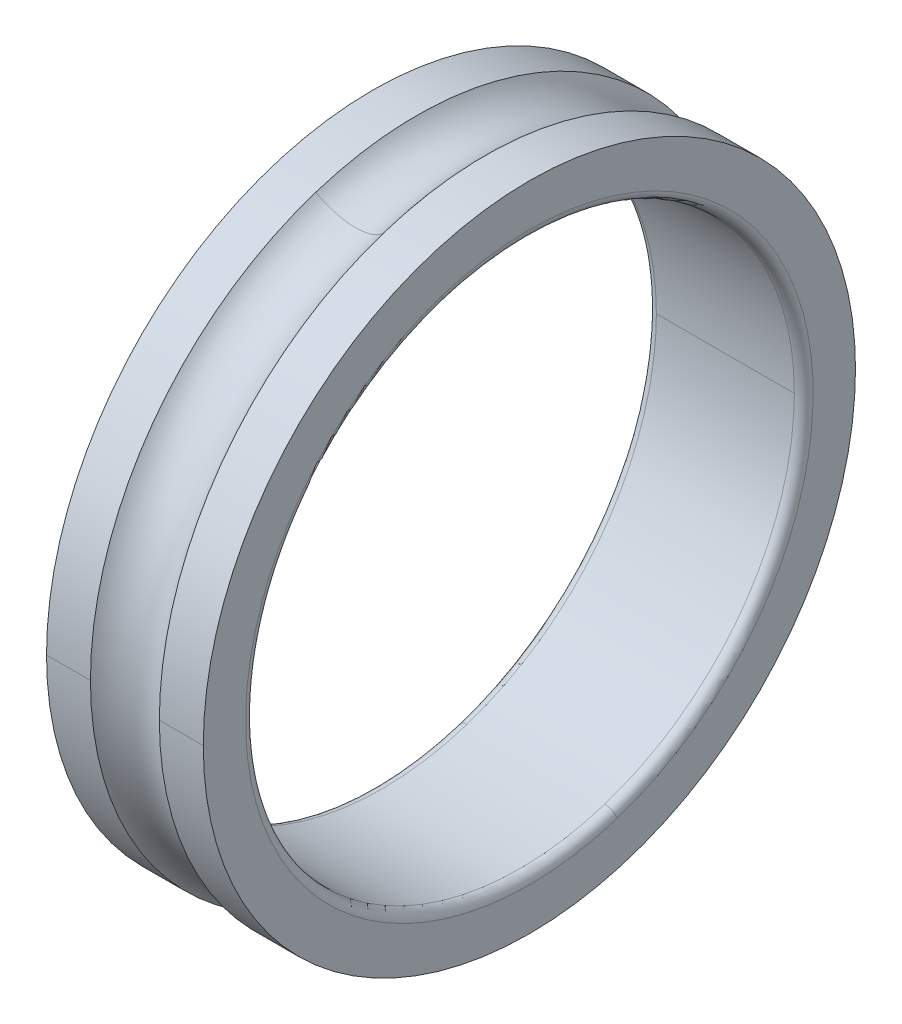
ISO-10303-21;
HEADER;
FILE_DESCRIPTION(('STEP AP214'),'2;1');
FILE_NAME('part.step','',(''),(''),'','','');
FILE_SCHEMA(('AUTOMOTIVE_DESIGN { 1 0 10303 214 1 1 1 1 }'));
ENDSEC;
DATA;
#1=APPLICATION_CONTEXT('core data for automotive mechanical design processes');
#2=APPLICATION_PROTOCOL_DEFINITION('international standard','automotive_design',2000,#1);
#3=PRODUCT_CONTEXT('',#1,'mechanical');
#4=PRODUCT('Part','Part','',(#3));
#5=PRODUCT_RELATED_PRODUCT_CATEGORY('part','',(#4));
#6=PRODUCT_DEFINITION_FORMATION('','',#4);
#7=PRODUCT_DEFINITION_CONTEXT('part definition',#1,'design');
#8=PRODUCT_DEFINITION('design','',#6,#7);
#9=PRODUCT_DEFINITION_SHAPE('','',#8);
#10=(LENGTH_UNIT() NAMED_UNIT(*) SI_UNIT(.MILLI.,.METRE.));
#11=(NAMED_UNIT(*) PLANE_ANGLE_UNIT() SI_UNIT($,.RADIAN.));
#12=(NAMED_UNIT(*) SI_UNIT($,.STERADIAN.) SOLID_ANGLE_UNIT());
#13=UNCERTAINTY_MEASURE_WITH_UNIT(LENGTH_MEASURE(1.E-05),#10,'distance_accuracy_value','');
#14=(GEOMETRIC_REPRESENTATION_CONTEXT(3) GLOBAL_UNCERTAINTY_ASSIGNED_CONTEXT((#13)) GLOBAL_UNIT_ASSIGNED_CONTEXT((#10,
#11,#12)) REPRESENTATION_CONTEXT('',''));
#15=CARTESIAN_POINT('',(0.,0.,0.));
#16=DIRECTION('',(0.,0.,1.));
#17=DIRECTION('',(1.,0.,0.));
#18=AXIS2_PLACEMENT_3D('',#15,#16,#17);
#19=CARTESIAN_POINT('',(10.,0.,0.));
#20=DIRECTION('',(1.,0.,0.));
#21=DIRECTION('',(0.,1.,0.));
#22=AXIS2_PLACEMENT_3D('',#19,#20,#21);
#23=CYLINDRICAL_SURFACE('',#22,20.8);
#24=DIRECTION('',(1.,0.,0.));
#25=VECTOR('',#24,1.);
#26=CARTESIAN_POINT('',(0.,0.,20.8));
#27=LINE('',#26,#25);
#28=CARTESIAN_POINT('',(0.,0.,20.8));
#29=VERTEX_POINT('',#28);
#30=CARTESIAN_POINT('',(2.8028919007022,0.,20.8));
#31=VERTEX_POINT('',#30);
#32=EDGE_CURVE('E10',#29,#31,#27,.T.);
#33=ORIENTED_EDGE('',*,*,#32,.F.);
#34=CARTESIAN_POINT('',(0.,0.,0.));
#35=DIRECTION('',(1.,0.,0.));
#36=DIRECTION('',(0.,0.,-1.));
#37=AXIS2_PLACEMENT_3D('',#34,#35,#36);
#38=CIRCLE('',#37,20.8);
#39=CARTESIAN_POINT('',(0.,0.,-20.8));
#40=VERTEX_POINT('',#39);
#41=EDGE_CURVE('E24',#29,#40,#38,.T.);
#42=ORIENTED_EDGE('',*,*,#41,.T.);
#43=DIRECTION('',(1.,0.,0.));
#44=VECTOR('',#43,1.);
#45=CARTESIAN_POINT('',(0.,0.,-20.8));
#46=LINE('',#45,#44);
#47=CARTESIAN_POINT('',(2.8028919007022,0.,-20.8));
#48=VERTEX_POINT('',#47);
#49=EDGE_CURVE('E325',#40,#48,#46,.T.);
#50=ORIENTED_EDGE('',*,*,#49,.T.);
#51=CARTESIAN_POINT('',(2.8028919007022,0.,0.));
#52=DIRECTION('',(1.,0.,0.));
#53=DIRECTION('',(0.,0.,-1.));
#54=AXIS2_PLACEMENT_3D('',#51,#52,#53);
#55=CIRCLE('',#54,20.8);
#56=CARTESIAN_POINT('',(2.8028919007022,-19.7819755389392,-6.4275534829989));
#57=VERTEX_POINT('',#56);
#58=EDGE_CURVE('E320',#57,#48,#55,.T.);
#59=ORIENTED_EDGE('',*,*,#58,.F.);
#60=CARTESIAN_POINT('',(2.8028919007022,0.,0.));
#61=DIRECTION('',(1.,0.,0.));
#62=DIRECTION('',(0.,0.,-1.));
#63=AXIS2_PLACEMENT_3D('',#60,#61,#62);
#64=CIRCLE('',#63,20.8);
#65=EDGE_CURVE('E315',#31,#57,#64,.T.);
#66=ORIENTED_EDGE('',*,*,#65,.F.);
#67=EDGE_LOOP('',(#33,#42,#50,#59,#66));
#68=FACE_BOUND('',#67,.T.);
#69=ADVANCED_FACE('F16',(#68),#23,.T.);
#70=CARTESIAN_POINT('',(5.,0.,0.));
#71=DIRECTION('',(1.,0.,0.));
#72=DIRECTION('',(0.,0.309016994374947,-0.951056516295154));
#73=AXIS2_PLACEMENT_3D('',#70,#71,#72);
#74=TOROIDAL_SURFACE('',#73,22.5,2.778);
#75=CARTESIAN_POINT('',(5.,-21.398771616641,-6.95288237343631));
#76=DIRECTION('',(0.,0.309016994374947,-0.951056516295154));
#77=DIRECTION('',(-0.79089564409568,0.582000027970398,0.189103272295685));
#78=AXIS2_PLACEMENT_3D('',#75,#76,#77);
#79=CIRCLE('',#78,2.778);
#80=CARTESIAN_POINT('',(7.1971080992978,-19.7819755389392,-6.4275534829989));
#81=VERTEX_POINT('',#80);
#82=EDGE_CURVE('E311',#57,#81,#79,.T.);
#83=ORIENTED_EDGE('',*,*,#82,.T.);
#84=CARTESIAN_POINT('',(7.1971080992978,0.,0.));
#85=DIRECTION('',(1.,0.,0.));
#86=DIRECTION('',(0.,0.,-1.));
#87=AXIS2_PLACEMENT_3D('',#84,#85,#86);
#88=CIRCLE('',#87,20.8);
#89=CARTESIAN_POINT('',(7.1971080992978,0.,20.8));
#90=VERTEX_POINT('',#89);
#91=EDGE_CURVE('E109',#90,#81,#88,.T.);
#92=ORIENTED_EDGE('',*,*,#91,.F.);
#93=CARTESIAN_POINT('',(7.1971080992978,0.,0.));
#94=DIRECTION('',(1.,0.,0.));
#95=DIRECTION('',(0.,0.,-1.));
#96=AXIS2_PLACEMENT_3D('',#93,#94,#95);
#97=CIRCLE('',#96,20.8);
#98=CARTESIAN_POINT('',(7.1971080992978,19.7819755389392,6.4275534829989));
#99=VERTEX_POINT('',#98);
#100=EDGE_CURVE('E304',#99,#90,#97,.T.);
#101=ORIENTED_EDGE('',*,*,#100,.F.);
#102=CARTESIAN_POINT('',(5.,21.398771616641,6.95288237343632));
#103=DIRECTION('',(0.,-0.309016994374948,0.951056516295154));
#104=DIRECTION('',(-0.79089564409568,-0.582000027970398,-0.189103272295685));
#105=AXIS2_PLACEMENT_3D('',#102,#103,#104);
#106=CIRCLE('',#105,2.778);
#107=CARTESIAN_POINT('',(2.8028919007022,19.7819755389392,6.4275534829989));
#108=VERTEX_POINT('',#107);
#109=EDGE_CURVE('E119',#108,#99,#106,.T.);
#110=ORIENTED_EDGE('',*,*,#109,.F.);
#111=CARTESIAN_POINT('',(2.8028919007022,0.,0.));
#112=DIRECTION('',(1.,0.,0.));
#113=DIRECTION('',(0.,0.,-1.));
#114=AXIS2_PLACEMENT_3D('',#111,#112,#113);
#115=CIRCLE('',#114,20.8);
#116=EDGE_CURVE('E296',#108,#31,#115,.T.);
#117=ORIENTED_EDGE('',*,*,#116,.T.);
#118=ORIENTED_EDGE('',*,*,#65,.T.);
#119=EDGE_LOOP('',(#83,#92,#101,#110,#117,#118));
#120=FACE_BOUND('',#119,.T.);
#121=ADVANCED_FACE('F338',(#120),#74,.F.);
#122=CARTESIAN_POINT('',(10.,0.,0.));
#123=DIRECTION('',(1.,0.,0.));
#124=DIRECTION('',(0.,-1.,0.));
#125=AXIS2_PLACEMENT_3D('',#122,#123,#124);
#126=CYLINDRICAL_SURFACE('',#125,20.8);
#127=ORIENTED_EDGE('',*,*,#32,.T.);
#128=ORIENTED_EDGE('',*,*,#116,.F.);
#129=CARTESIAN_POINT('',(2.8028919007022,0.,0.));
#130=DIRECTION('',(1.,0.,0.));
#131=DIRECTION('',(0.,0.,-1.));
#132=AXIS2_PLACEMENT_3D('',#129,#130,#131);
#133=CIRCLE('',#132,20.8);
#134=EDGE_CURVE('E292',#48,#108,#133,.T.);
#135=ORIENTED_EDGE('',*,*,#134,.F.);
#136=ORIENTED_EDGE('',*,*,#49,.F.);
#137=CARTESIAN_POINT('',(0.,0.,0.));
#138=DIRECTION('',(1.,0.,0.));
#139=DIRECTION('',(0.,0.,-1.));
#140=AXIS2_PLACEMENT_3D('',#137,#138,#139);
#141=CIRCLE('',#140,20.8);
#142=EDGE_CURVE('E288',#40,#29,#141,.T.);
#143=ORIENTED_EDGE('',*,*,#142,.T.);
#144=EDGE_LOOP('',(#127,#128,#135,#136,#143));
#145=FACE_BOUND('',#144,.T.);
#146=ADVANCED_FACE('F269',(#145),#126,.T.);
#147=CARTESIAN_POINT('',(0.,20.8,0.));
#148=DIRECTION('',(-1.,0.,0.));
#149=DIRECTION('',(0.,0.,1.));
#150=AXIS2_PLACEMENT_3D('',#147,#148,#149);
#151=PLANE('',#150);
#152=CARTESIAN_POINT('',(0.,0.,0.));
#153=DIRECTION('',(1.,0.,0.));
#154=DIRECTION('',(0.,0.,-1.));
#155=AXIS2_PLACEMENT_3D('',#152,#153,#154);
#156=CIRCLE('',#155,18.1);
#157=CARTESIAN_POINT('',(0.,17.2141229449423,5.59320759818655));
#158=VERTEX_POINT('',#157);
#159=CARTESIAN_POINT('',(0.,-17.2141229449423,-5.59320759818655));
#160=VERTEX_POINT('',#159);
#161=EDGE_CURVE('E286',#158,#160,#156,.T.);
#162=ORIENTED_EDGE('',*,*,#161,.T.);
#163=CARTESIAN_POINT('',(0.,-17.2141229449423,-5.59320759818655));
#164=CARTESIAN_POINT('',(0.,-16.335508265428,-8.29717040682863));
#165=CARTESIAN_POINT('',(0.,-14.9261904033727,-10.8287816086525));
#166=CARTESIAN_POINT('',(0.,-13.0303691620416,-13.0483834617994));
#167=CARTESIAN_POINT('',(0.,-8.4706181829976,-16.6245178914706));
#168=CARTESIAN_POINT('',(0.,-2.89730665310646,-18.2114531064973));
#169=CARTESIAN_POINT('',(0.,0.0127387291985331,-18.440483607408));
#170=CARTESIAN_POINT('',(0.,5.76567660119024,-17.7449279561598));
#171=CARTESIAN_POINT('',(0.,10.8287384611672,-14.9261522600416));
#172=CARTESIAN_POINT('',(0.,13.0483938790937,-13.0303809333539));
#173=CARTESIAN_POINT('',(0.,16.6245205059853,-8.47061305172364));
#174=CARTESIAN_POINT('',(0.,18.2114374601735,-2.89730514434207));
#175=CARTESIAN_POINT('',(0.,18.4405398274668,0.0127262422372256));
#176=CARTESIAN_POINT('',(0.,18.0926581993751,2.8892189827711));
#177=CARTESIAN_POINT('',(0.,17.2141229449423,5.59320759818654));
#178=B_SPLINE_CURVE_WITH_KNOTS('',5,(#163,#164,#165,#166,#167,#168,#169,#170,#171,#172,#173,
#174,#175,#176,#177),.UNSPECIFIED.,.F.,.F.,(6,3,3,3,6),(0.,0.785398163397448,1.5707963267949,
2.35619449019234,3.14159265358979),.UNSPECIFIED.);
#179=EDGE_CURVE('E284',#160,#158,#178,.T.);
#180=ORIENTED_EDGE('',*,*,#179,.T.);
#181=EDGE_LOOP('',(#162,#180));
#182=FACE_BOUND('',#181,.T.);
#183=ORIENTED_EDGE('',*,*,#41,.F.);
#184=ORIENTED_EDGE('',*,*,#142,.F.);
#185=EDGE_LOOP('',(#183,#184));
#186=FACE_BOUND('',#185,.T.);
#187=ADVANCED_FACE('F263',(#182,#186),#151,.T.);
#188=CARTESIAN_POINT('',(0.599999999999872,0.,0.));
#189=DIRECTION('',(1.,0.,0.));
#190=DIRECTION('',(0.,-0.309016994374947,0.951056516295154));
#191=AXIS2_PLACEMENT_3D('',#188,#189,#190);
#192=TOROIDAL_SURFACE('',#191,18.1,0.599999999999872);
#193=CARTESIAN_POINT('',(0.599999999999872,-17.2141229449423,-5.59320759818655));
#194=DIRECTION('',(0.,0.309016994374947,-0.951056516295154));
#195=DIRECTION('',(-1.,0.,0.));
#196=AXIS2_PLACEMENT_3D('',#193,#194,#195);
#197=CIRCLE('',#196,0.599999999999872);
#198=CARTESIAN_POINT('',(0.600000000000001,-16.6434890351653,-5.40779740156162));
#199=VERTEX_POINT('',#198);
#200=EDGE_CURVE('E493',#160,#199,#197,.T.);
#201=ORIENTED_EDGE('',*,*,#200,.T.);
#202=CARTESIAN_POINT('',(0.6,0.,0.));
#203=DIRECTION('',(1.,0.,0.));
#204=DIRECTION('',(0.,0.,-1.));
#205=AXIS2_PLACEMENT_3D('',#202,#203,#204);
#206=CIRCLE('',#205,17.5);
#207=CARTESIAN_POINT('',(0.6,0.,-17.5));
#208=VERTEX_POINT('',#207);
#209=EDGE_CURVE('E491',#199,#208,#206,.T.);
#210=ORIENTED_EDGE('',*,*,#209,.T.);
#211=CARTESIAN_POINT('',(0.6,0.,0.));
#212=DIRECTION('',(1.,0.,0.));
#213=DIRECTION('',(0.,0.,-1.));
#214=AXIS2_PLACEMENT_3D('',#211,#212,#213);
#215=CIRCLE('',#214,17.5);
#216=CARTESIAN_POINT('',(0.6,16.6434890351653,5.40779740156162));
#217=VERTEX_POINT('',#216);
#218=EDGE_CURVE('E489',#208,#217,#215,.T.);
#219=ORIENTED_EDGE('',*,*,#218,.T.);
#220=CARTESIAN_POINT('',(0.599999999999872,17.2141229449423,5.59320759818655));
#221=DIRECTION('',(0.,-0.309016994374947,0.951056516295154));
#222=DIRECTION('',(-1.,0.,0.));
#223=AXIS2_PLACEMENT_3D('',#220,#221,#222);
#224=CIRCLE('',#223,0.599999999999872);
#225=EDGE_CURVE('E243',#158,#217,#224,.T.);
#226=ORIENTED_EDGE('',*,*,#225,.F.);
#227=ORIENTED_EDGE('',*,*,#179,.F.);
#228=EDGE_LOOP('',(#201,#210,#219,#226,#227));
#229=FACE_BOUND('',#228,.T.);
#230=ADVANCED_FACE('F252',(#229),#192,.T.);
#231=CARTESIAN_POINT('',(0.599999999999872,0.,0.));
#232=DIRECTION('',(1.,0.,0.));
#233=DIRECTION('',(0.,0.309016994374947,-0.951056516295154));
#234=AXIS2_PLACEMENT_3D('',#231,#232,#233);
#235=TOROIDAL_SURFACE('',#234,18.1,0.599999999999872);
#236=ORIENTED_EDGE('',*,*,#200,.F.);
#237=ORIENTED_EDGE('',*,*,#161,.F.);
#238=ORIENTED_EDGE('',*,*,#225,.T.);
#239=CARTESIAN_POINT('',(0.6,0.,0.));
#240=DIRECTION('',(1.,0.,0.));
#241=DIRECTION('',(0.,0.,-1.));
#242=AXIS2_PLACEMENT_3D('',#239,#240,#241);
#243=CIRCLE('',#242,17.5);
#244=CARTESIAN_POINT('',(0.6,0.,17.5));
#245=VERTEX_POINT('',#244);
#246=EDGE_CURVE('E239',#217,#245,#243,.T.);
#247=ORIENTED_EDGE('',*,*,#246,.T.);
#248=CARTESIAN_POINT('',(0.6,0.,0.));
#249=DIRECTION('',(1.,0.,0.));
#250=DIRECTION('',(0.,0.,-1.));
#251=AXIS2_PLACEMENT_3D('',#248,#249,#250);
#252=CIRCLE('',#251,17.5);
#253=EDGE_CURVE('E234',#245,#199,#252,.T.);
#254=ORIENTED_EDGE('',*,*,#253,.T.);
#255=EDGE_LOOP('',(#236,#237,#238,#247,#254));
#256=FACE_BOUND('',#255,.T.);
#257=ADVANCED_FACE('F262',(#256),#235,.T.);
#258=CARTESIAN_POINT('',(10.,0.,0.));
#259=DIRECTION('',(1.,0.,0.));
#260=DIRECTION('',(0.,1.,0.));
#261=AXIS2_PLACEMENT_3D('',#258,#259,#260);
#262=CYLINDRICAL_SURFACE('',#261,17.5);
#263=DIRECTION('',(1.,0.,0.));
#264=VECTOR('',#263,1.);
#265=CARTESIAN_POINT('',(0.6,0.,17.5));
#266=LINE('',#265,#264);
#267=CARTESIAN_POINT('',(9.4,0.,17.5));
#268=VERTEX_POINT('',#267);
#269=EDGE_CURVE('E230',#245,#268,#266,.T.);
#270=ORIENTED_EDGE('',*,*,#269,.T.);
#271=CARTESIAN_POINT('',(9.4,0.,0.));
#272=DIRECTION('',(1.,0.,0.));
#273=DIRECTION('',(0.,0.,-1.));
#274=AXIS2_PLACEMENT_3D('',#271,#272,#273);
#275=CIRCLE('',#274,17.5);
#276=CARTESIAN_POINT('',(9.4,-16.6434890351653,-5.4077974015616));
#277=VERTEX_POINT('',#276);
#278=EDGE_CURVE('E226',#268,#277,#275,.T.);
#279=ORIENTED_EDGE('',*,*,#278,.T.);
#280=CARTESIAN_POINT('',(9.4,0.,0.));
#281=DIRECTION('',(1.,0.,0.));
#282=DIRECTION('',(0.,0.,-1.));
#283=AXIS2_PLACEMENT_3D('',#280,#281,#282);
#284=CIRCLE('',#283,17.5);
#285=CARTESIAN_POINT('',(9.4,0.,-17.5));
#286=VERTEX_POINT('',#285);
#287=EDGE_CURVE('E222',#277,#286,#284,.T.);
#288=ORIENTED_EDGE('',*,*,#287,.T.);
#289=DIRECTION('',(1.,0.,0.));
#290=VECTOR('',#289,1.);
#291=CARTESIAN_POINT('',(0.6,0.,-17.5));
#292=LINE('',#291,#290);
#293=EDGE_CURVE('E217',#208,#286,#292,.T.);
#294=ORIENTED_EDGE('',*,*,#293,.F.);
#295=ORIENTED_EDGE('',*,*,#209,.F.);
#296=ORIENTED_EDGE('',*,*,#253,.F.);
#297=EDGE_LOOP('',(#270,#279,#288,#294,#295,#296));
#298=FACE_BOUND('',#297,.T.);
#299=ADVANCED_FACE('F389',(#298),#262,.F.);
#300=CARTESIAN_POINT('',(10.,0.,0.));
#301=DIRECTION('',(1.,0.,0.));
#302=DIRECTION('',(0.,-1.,0.));
#303=AXIS2_PLACEMENT_3D('',#300,#301,#302);
#304=CYLINDRICAL_SURFACE('',#303,17.5);
#305=ORIENTED_EDGE('',*,*,#269,.F.);
#306=ORIENTED_EDGE('',*,*,#246,.F.);
#307=ORIENTED_EDGE('',*,*,#218,.F.);
#308=ORIENTED_EDGE('',*,*,#293,.T.);
#309=CARTESIAN_POINT('',(9.4,0.,0.));
#310=DIRECTION('',(1.,0.,0.));
#311=DIRECTION('',(0.,0.,-1.));
#312=AXIS2_PLACEMENT_3D('',#309,#310,#311);
#313=CIRCLE('',#312,17.5);
#314=CARTESIAN_POINT('',(9.4,16.6434890351653,5.4077974015616));
#315=VERTEX_POINT('',#314);
#316=EDGE_CURVE('E213',#286,#315,#313,.T.);
#317=ORIENTED_EDGE('',*,*,#316,.T.);
#318=CARTESIAN_POINT('',(9.4,0.,0.));
#319=DIRECTION('',(1.,0.,0.));
#320=DIRECTION('',(0.,0.,-1.));
#321=AXIS2_PLACEMENT_3D('',#318,#319,#320);
#322=CIRCLE('',#321,17.5);
#323=EDGE_CURVE('E208',#315,#268,#322,.T.);
#324=ORIENTED_EDGE('',*,*,#323,.T.);
#325=EDGE_LOOP('',(#305,#306,#307,#308,#317,#324));
#326=FACE_BOUND('',#325,.T.);
#327=ADVANCED_FACE('F399',(#326),#304,.F.);
#328=CARTESIAN_POINT('',(9.4,0.,0.));
#329=DIRECTION('',(1.,0.,0.));
#330=DIRECTION('',(0.,0.309016994374947,-0.951056516295154));
#331=AXIS2_PLACEMENT_3D('',#328,#329,#330);
#332=TOROIDAL_SURFACE('',#331,18.1,0.599999999999924);
#333=CARTESIAN_POINT('',(9.4,-17.2141229449423,-5.59320759818655));
#334=DIRECTION('',(0.,0.309016994374946,-0.951056516295154));
#335=DIRECTION('',(0.,0.951056516295154,0.309016994374946));
#336=AXIS2_PLACEMENT_3D('',#333,#334,#335);
#337=CIRCLE('',#336,0.599999999999923);
#338=CARTESIAN_POINT('',(9.99999999999992,-17.2141229449423,-5.59320759818655));
#339=VERTEX_POINT('',#338);
#340=EDGE_CURVE('E187',#277,#339,#337,.T.);
#341=ORIENTED_EDGE('',*,*,#340,.F.);
#342=ORIENTED_EDGE('',*,*,#278,.F.);
#343=ORIENTED_EDGE('',*,*,#323,.F.);
#344=CARTESIAN_POINT('',(9.4,17.2141229449423,5.59320759818655));
#345=DIRECTION('',(0.,-0.309016994374946,0.951056516295154));
#346=DIRECTION('',(0.,-0.951056516295154,-0.309016994374946));
#347=AXIS2_PLACEMENT_3D('',#344,#345,#346);
#348=CIRCLE('',#347,0.599999999999923);
#349=CARTESIAN_POINT('',(9.99999999999992,17.2141229449423,5.59320759818655));
#350=VERTEX_POINT('',#349);
#351=EDGE_CURVE('E186',#315,#350,#348,.T.);
#352=ORIENTED_EDGE('',*,*,#351,.T.);
#353=CARTESIAN_POINT('',(9.99999999999992,17.2141229449423,5.59320759818658));
#354=CARTESIAN_POINT('',(9.99999999999992,17.1226101820371,5.87487525199306));
#355=CARTESIAN_POINT('',(9.99999999999992,17.0241727376831,6.15429237833412));
#356=CARTESIAN_POINT('',(9.99999999999992,16.8137114445011,6.70796224801701));
#357=CARTESIAN_POINT('',(9.99999999999992,16.7016875956731,6.98221499135884));
#358=CARTESIAN_POINT('',(9.99999999999992,16.4643164519672,7.52489276697492));
#359=CARTESIAN_POINT('',(9.99999999999992,16.3389691570892,7.79331779924916));
#360=CARTESIAN_POINT('',(9.99999999999992,16.0752549472576,8.32369419780484));
#361=CARTESIAN_POINT('',(9.99999999999992,15.9368880323038,8.58564556408628));
#362=CARTESIAN_POINT('',(9.99999999999992,15.6474674237314,9.10244337810354));
#363=CARTESIAN_POINT('',(9.99999999999992,15.4964137301127,9.35728982583937));
#364=CARTESIAN_POINT('',(9.99999999999992,15.1819835988545,9.85926390593092));
#365=CARTESIAN_POINT('',(9.99999999999992,15.018607161215,10.1063915382867));
#366=CARTESIAN_POINT('',(9.99999999999992,14.6799250944086,10.592332621953));
#367=CARTESIAN_POINT('',(9.99999999999992,14.5046194652418,10.8311460732635));
#368=CARTESIAN_POINT('',(9.99999999999992,14.1425013515501,11.2998834759493));
#369=CARTESIAN_POINT('',(9.99999999999992,13.9556888670253,11.5298074273244));
#370=CARTESIAN_POINT('',(9.99999999999992,13.5710070876958,11.9802119222283));
#371=CARTESIAN_POINT('',(9.99999999999992,13.3731377928912,12.2006924657571));
#372=CARTESIAN_POINT('',(9.99999999999992,12.9668190781504,12.6316789882879));
#373=CARTESIAN_POINT('',(9.99999999999992,12.7583696582144,12.8421849672899));
#374=CARTESIAN_POINT('',(9.99999999999992,12.3313928659376,13.2527152333558));
#375=CARTESIAN_POINT('',(9.99999999999992,12.112865493597,13.4527395204196));
#376=CARTESIAN_POINT('',(9.99999999999992,11.6662592481411,13.8418245266001));
#377=CARTESIAN_POINT('',(9.99999999999992,11.4381803750258,14.0308852457169));
#378=CARTESIAN_POINT('',(9.99999999999992,10.9730205899901,14.3975876521661));
#379=CARTESIAN_POINT('',(9.99999999999992,10.7359396780697,14.5752293394987));
#380=CARTESIAN_POINT('',(9.99999999999992,10.25334696411,14.9186657279965));
#381=CARTESIAN_POINT('',(9.99999999999992,10.0078351620707,15.0844604291618));
#382=CARTESIAN_POINT('',(9.99999999999992,9.5089721273075,15.4038034313678));
#383=CARTESIAN_POINT('',(9.99999999999992,9.25562089458368,15.5573517324085));
#384=CARTESIAN_POINT('',(9.99999999999992,8.74168934376238,15.851832023059));
#385=CARTESIAN_POINT('',(9.99999999999992,8.4811090256649,15.9927640126688));
#386=CARTESIAN_POINT('',(9.99999999999992,7.95334706490666,16.2616721629502));
#387=CARTESIAN_POINT('',(9.99999999999992,7.6861654222459,16.3896483236218));
#388=CARTESIAN_POINT('',(9.99999999999992,7.14584447634064,16.6323365102465));
#389=CARTESIAN_POINT('',(9.99999999999992,6.87270517309613,16.7470485361996));
#390=CARTESIAN_POINT('',(9.99999999999992,6.32112692252905,16.9629321020691));
#391=CARTESIAN_POINT('',(9.99999999999992,6.04268797520649,17.0641036419855));
#392=CARTESIAN_POINT('',(9.99999999999992,5.48118122029578,17.2526625046804));
#393=CARTESIAN_POINT('',(9.99999999999992,5.19811341270763,17.3400498274589));
#394=CARTESIAN_POINT('',(9.99999999999992,4.62803087240803,17.5008297321632));
#395=CARTESIAN_POINT('',(9.99999999999992,4.34101613969659,17.5742223140889));
#396=CARTESIAN_POINT('',(9.99999999999992,3.76373119278102,17.7068359279295));
#397=CARTESIAN_POINT('',(9.99999999999992,3.4734609785769,17.7660569598443));
#398=CARTESIAN_POINT('',(9.99999999999992,2.89036435504668,17.8701848050098));
#399=CARTESIAN_POINT('',(9.99999999999992,2.59753794572058,17.9150916182606));
#400=CARTESIAN_POINT('',(9.99999999999992,2.01003437641503,17.9904828416515));
#401=CARTESIAN_POINT('',(9.99999999999992,1.71535721643557,18.0209672517917));
#402=CARTESIAN_POINT('',(9.99999999999992,1.12486204891237,18.0674402293475));
#403=CARTESIAN_POINT('',(9.99999999999992,0.829044041368624,18.083428796763));
#404=CARTESIAN_POINT('',(9.99999999999992,0.236979830207606,18.1008715710101));
#405=CARTESIAN_POINT('',(9.99999999999992,-0.059266373409664,18.1023257778417));
#406=CARTESIAN_POINT('',(9.99999999999992,-0.651473293665111,18.0906963276091));
#407=CARTESIAN_POINT('',(9.99999999999992,-0.947434010303287,18.077612670545));
#408=CARTESIAN_POINT('',(9.99999999999992,-1.53835696131107,18.036939012197));
#409=CARTESIAN_POINT('',(9.99999999999992,-1.83331919568067,18.0093490109131));
#410=CARTESIAN_POINT('',(9.99999999999992,-2.42153459229307,17.9397291308552));
#411=CARTESIAN_POINT('',(9.99999999999992,-2.71478775453586,17.8976992520813));
#412=CARTESIAN_POINT('',(9.99999999999992,-3.29887853434086,17.7993008707026));
#413=CARTESIAN_POINT('',(9.99999999999992,-3.58971615190306,17.7429323680978));
#414=CARTESIAN_POINT('',(9.99999999999992,-4.1682751890518,17.6159925357177));
#415=CARTESIAN_POINT('',(9.99999999999992,-4.45599660863833,17.5454212059424));
#416=CARTESIAN_POINT('',(9.99999999999992,-5.02763010373451,17.3902457317357));
#417=CARTESIAN_POINT('',(9.99999999999992,-5.31154217924417,17.3056415873044));
#418=CARTESIAN_POINT('',(9.99999999999992,-5.87487301712894,17.1226043025802));
#419=CARTESIAN_POINT('',(9.99999999999992,-6.15429177950407,17.0241711622874));
#420=CARTESIAN_POINT('',(9.99999999999992,-6.70796284684702,16.8137130198968));
#421=CARTESIAN_POINT('',(9.99999999999992,-6.98221515181484,16.7016880177991));
#422=CARTESIAN_POINT('',(9.99999999999992,-7.52489260651888,16.4643160298412));
#423=CARTESIAN_POINT('',(9.99999999999992,-7.79331775625508,16.3389690439809));
#424=CARTESIAN_POINT('',(9.99999999999992,-8.32369424079888,16.0752550603659));
#425=CARTESIAN_POINT('',(9.99999999999992,-8.58564557560648,15.9368880626111));
#426=CARTESIAN_POINT('',(9.99999999999992,-9.10244336658329,15.6474673934241));
#427=CARTESIAN_POINT('',(9.99999999999992,-9.3572898227525,15.4964137219919));
#428=CARTESIAN_POINT('',(9.99999999999992,-9.85926390901773,15.1819836069754));
#429=CARTESIAN_POINT('',(9.99999999999992,-10.1063915391137,15.018607163391));
#430=CARTESIAN_POINT('',(9.99999999999992,-10.5923326211258,14.6799250922326));
#431=CARTESIAN_POINT('',(9.99999999999992,-10.8311460730419,14.5046194646587));
#432=CARTESIAN_POINT('',(9.99999999999992,-11.2998834761709,14.1425013521332));
#433=CARTESIAN_POINT('',(9.99999999999992,-11.5298074273837,13.9556888671815));
#434=CARTESIAN_POINT('',(9.99999999999992,-11.9802119221689,13.5710070875396));
#435=CARTESIAN_POINT('',(9.99999999999992,-12.2006924657412,13.3731377928493));
#436=CARTESIAN_POINT('',(9.99999999999992,-12.6316789883038,12.9668190781923));
#437=CARTESIAN_POINT('',(9.99999999999992,-12.8421849672942,12.7583696582256));
#438=CARTESIAN_POINT('',(9.99999999999992,-13.2527152333515,12.3313928659264));
#439=CARTESIAN_POINT('',(9.99999999999992,-13.4527395204184,12.112865493594));
#440=CARTESIAN_POINT('',(9.99999999999992,-13.8418245266013,11.6662592481441));
#441=CARTESIAN_POINT('',(9.99999999999992,-14.0308852457172,11.4381803750266));
#442=CARTESIAN_POINT('',(9.99999999999992,-14.3975876521658,10.9730205899894));
#443=CARTESIAN_POINT('',(9.99999999999992,-14.5752293394986,10.7359396780696));
#444=CARTESIAN_POINT('',(9.99999999999992,-14.9186657279966,10.2533469641103));
#445=CARTESIAN_POINT('',(9.99999999999992,-15.0844604291618,10.0078351620708));
#446=CARTESIAN_POINT('',(9.99999999999992,-15.4038034313678,9.50897212730747));
#447=CARTESIAN_POINT('',(9.99999999999992,-15.5573517324085,9.25562089458369));
#448=CARTESIAN_POINT('',(9.99999999999992,-15.851832023059,8.74168934376241));
#449=CARTESIAN_POINT('',(9.99999999999992,-15.9927640126688,8.48110902566492));
#450=CARTESIAN_POINT('',(9.99999999999992,-16.2616721629502,7.95334706490667));
#451=CARTESIAN_POINT('',(9.99999999999992,-16.3896483236218,7.68616542224593));
#452=CARTESIAN_POINT('',(9.99999999999992,-16.6323365102465,7.14584447634066));
#453=CARTESIAN_POINT('',(9.99999999999992,-16.7470485361997,6.87270517309614));
#454=CARTESIAN_POINT('',(9.99999999999992,-16.962932102069,6.3211269225291));
#455=CARTESIAN_POINT('',(9.99999999999992,-17.0641036419853,6.04268797520658));
#456=CARTESIAN_POINT('',(9.99999999999992,-17.2526625046806,5.48118122029574));
#457=CARTESIAN_POINT('',(9.99999999999992,-17.3400498274597,5.19811341270742));
#458=CARTESIAN_POINT('',(9.99999999999992,-17.5008297321623,4.62803087240827));
#459=CARTESIAN_POINT('',(9.99999999999992,-17.5742223140858,4.34101613969745));
#460=CARTESIAN_POINT('',(9.99999999999992,-17.7068359279326,3.7637311927802));
#461=CARTESIAN_POINT('',(9.99999999999992,-17.7660569598559,3.47346097857379));
#462=CARTESIAN_POINT('',(9.99999999999992,-17.8701848049982,2.89036435504986));
#463=CARTESIAN_POINT('',(9.99999999999992,-17.9150916182173,2.59753794573235));
#464=CARTESIAN_POINT('',(9.99999999999992,-17.9904828416947,2.01003437640333));
#465=CARTESIAN_POINT('',(9.99999999999992,-18.020967251953,1.71535721639182));
#466=CARTESIAN_POINT('',(9.99999999999992,-18.0674402291862,1.12486204895619));
#467=CARTESIAN_POINT('',(9.99999999999992,-18.0834287961611,0.829044041532065));
#468=CARTESIAN_POINT('',(9.99999999999992,-18.1008715716121,0.23697983004423));
#469=CARTESIAN_POINT('',(9.99999999999992,-18.1023257800882,-0.0592663740194813));
#470=CARTESIAN_POINT('',(9.99999999999992,-18.0906963253625,-0.651473293055227));
#471=CARTESIAN_POINT('',(9.99999999999992,-18.0776126621607,-0.947434008027262));
#472=CARTESIAN_POINT('',(9.99999999999992,-18.0369390205813,-1.53835696358703));
#473=CARTESIAN_POINT('',(9.99999999999992,-18.0093490422036,-1.83331920417477));
#474=CARTESIAN_POINT('',(9.99999999999992,-17.9397290995647,-2.42153458379894));
#475=CARTESIAN_POINT('',(9.99999999999992,-17.8976991353034,-2.71478772283537));
#476=CARTESIAN_POINT('',(9.99999999999992,-17.7993009874804,-3.29887856604132));
#477=CARTESIAN_POINT('',(9.99999999999992,-17.7429328039187,-3.58971627021084));
#478=CARTESIAN_POINT('',(9.99999999999992,-17.6159920998969,-4.16827507074397));
#479=CARTESIAN_POINT('',(9.99999999999992,-17.545419579437,-4.45599616710759));
#480=CARTESIAN_POINT('',(9.99999999999992,-17.3902473582411,-5.0276305452652));
#481=CARTESIAN_POINT('',(9.99999999999992,-17.3056476575051,-5.3115438270592));
#482=CARTESIAN_POINT('',(9.99999999999992,-17.2141229449423,-5.59320759818653));
#483=B_SPLINE_CURVE_WITH_KNOTS('',3,(#353,#354,#355,#356,#357,#358,#359,#360,#361,#362,#363,
#364,#365,#366,#367,#368,#369,#370,#371,#372,#373,#374,#375,#376,#377,#378,#379,#380,#381,#382,
#383,#384,#385,#386,#387,#388,#389,#390,#391,#392,#393,#394,#395,#396,#397,#398,#399,#400,#401,
#402,#403,#404,#405,#406,#407,#408,#409,#410,#411,#412,#413,#414,#415,#416,#417,#418,#419,#420,
#421,#422,#423,#424,#425,#426,#427,#428,#429,#430,#431,#432,#433,#434,#435,#436,#437,#438,#439,
#440,#441,#442,#443,#444,#445,#446,#447,#448,#449,#450,#451,#452,#453,#454,#455,#456,#457,#458,
#459,#460,#461,#462,#463,#464,#465,#466,#467,#468,#469,#470,#471,#472,#473,#474,#475,#476,#477,
#478,#479,#480,#481,#482),.UNSPECIFIED.,.F.,.F.,(4,2,2,2,2,2,2,2,2,2,2,2,2,2,2,2,2,2,2,2,2,2,2,
2,2,2,2,2,2,2,2,2,2,2,2,2,2,2,2,2,2,2,2,2,2,2,2,2,2,2,2,2,2,2,2,2,2,2,2,2,2,2,2,2,4),(0.,
0.888392472529422,1.77678494505885,2.66517741758827,3.5535698901177,4.44196236264712,
5.33035483517655,6.21874730770596,7.1071397802354,7.99553225276482,8.88392472529424,
9.77231719782367,10.6607096703531,11.5491021428825,12.4374946154119,13.3258870879414,
14.2142795604708,15.1026720330002,15.9910645055296,16.8794569780591,17.7678494505885,
18.6562419231179,19.5446343956473,20.4330268681768,21.3214193407062,22.2098118132356,
23.098204285765,23.9865967582944,24.8749892308239,25.7633817033533,26.6517741758827,
27.5401666484122,28.4285591209416,29.316951593471,30.2053440660004,31.0937365385298,
31.9821290110593,32.8705214835887,33.7589139561181,34.6473064286475,35.535698901177,
36.4240913737064,37.3124838462358,38.2008763187652,39.0892687912946,39.9776612638241,
40.8660537363535,41.7544462088829,42.6428386814124,43.5312311539418,44.4196236264712,
45.3080160990006,46.19640857153,47.0848010440595,47.9731935165889,48.8615859891183,
49.7499784616477,50.6383709341772,51.5267634067066,52.415155879236,53.3035483517654,
54.1919408242949,55.0803332968243,55.9687257693537,56.8571182418831),.UNSPECIFIED.);
#484=EDGE_CURVE('E181',#350,#339,#483,.T.);
#485=ORIENTED_EDGE('',*,*,#484,.T.);
#486=EDGE_LOOP('',(#341,#342,#343,#352,#485));
#487=FACE_BOUND('',#486,.T.);
#488=ADVANCED_FACE('F161',(#487),#332,.T.);
#489=CARTESIAN_POINT('',(10.,18.1,0.));
#490=DIRECTION('',(1.,0.,0.));
#491=DIRECTION('',(0.,0.,-1.));
#492=AXIS2_PLACEMENT_3D('',#489,#490,#491);
#493=PLANE('',#492);
#494=CARTESIAN_POINT('',(10.,0.,0.));
#495=DIRECTION('',(1.,0.,0.));
#496=DIRECTION('',(0.,0.,-1.));
#497=AXIS2_PLACEMENT_3D('',#494,#495,#496);
#498=CIRCLE('',#497,20.8);
#499=CARTESIAN_POINT('',(10.,0.,-20.8));
#500=VERTEX_POINT('',#499);
#501=CARTESIAN_POINT('',(10.,0.,20.8));
#502=VERTEX_POINT('',#501);
#503=EDGE_CURVE('E126',#500,#502,#498,.T.);
#504=ORIENTED_EDGE('',*,*,#503,.T.);
#505=CARTESIAN_POINT('',(10.,0.,0.));
#506=DIRECTION('',(1.,0.,0.));
#507=DIRECTION('',(0.,0.,-1.));
#508=AXIS2_PLACEMENT_3D('',#505,#506,#507);
#509=CIRCLE('',#508,20.8);
#510=EDGE_CURVE('E189',#502,#500,#509,.T.);
#511=ORIENTED_EDGE('',*,*,#510,.T.);
#512=EDGE_LOOP('',(#504,#511));
#513=FACE_BOUND('',#512,.T.);
#514=CARTESIAN_POINT('',(9.99999999999992,-17.2141229449423,-5.59320759818658));
#515=CARTESIAN_POINT('',(9.99999999999992,-17.1226101820371,-5.87487525199306));
#516=CARTESIAN_POINT('',(9.99999999999992,-17.0241727376831,-6.15429237833412));
#517=CARTESIAN_POINT('',(9.99999999999992,-16.8137114445011,-6.70796224801701));
#518=CARTESIAN_POINT('',(9.99999999999992,-16.7016875956731,-6.98221499135884));
#519=CARTESIAN_POINT('',(9.99999999999992,-16.4643164519672,-7.52489276697492));
#520=CARTESIAN_POINT('',(9.99999999999992,-16.3389691570892,-7.79331779924916));
#521=CARTESIAN_POINT('',(9.99999999999992,-16.0752549472576,-8.32369419780484));
#522=CARTESIAN_POINT('',(9.99999999999992,-15.9368880323038,-8.58564556408628));
#523=CARTESIAN_POINT('',(9.99999999999992,-15.6474674237314,-9.10244337810354));
#524=CARTESIAN_POINT('',(9.99999999999992,-15.4964137301127,-9.35728982583936));
#525=CARTESIAN_POINT('',(9.99999999999992,-15.1819835988545,-9.85926390593091));
#526=CARTESIAN_POINT('',(9.99999999999992,-15.018607161215,-10.1063915382866));
#527=CARTESIAN_POINT('',(9.99999999999992,-14.6799250944086,-10.592332621953));
#528=CARTESIAN_POINT('',(9.99999999999992,-14.5046194652418,-10.8311460732635));
#529=CARTESIAN_POINT('',(9.99999999999992,-14.1425013515501,-11.2998834759493));
#530=CARTESIAN_POINT('',(9.99999999999992,-13.9556888670253,-11.5298074273244));
#531=CARTESIAN_POINT('',(9.99999999999992,-13.5710070876958,-11.9802119222283));
#532=CARTESIAN_POINT('',(9.99999999999992,-13.3731377928912,-12.2006924657571));
#533=CARTESIAN_POINT('',(9.99999999999992,-12.9668190781504,-12.6316789882879));
#534=CARTESIAN_POINT('',(9.99999999999992,-12.7583696582144,-12.8421849672899));
#535=CARTESIAN_POINT('',(9.99999999999992,-12.3313928659376,-13.2527152333558));
#536=CARTESIAN_POINT('',(9.99999999999992,-12.112865493597,-13.4527395204196));
#537=CARTESIAN_POINT('',(9.99999999999992,-11.6662592481411,-13.8418245266001));
#538=CARTESIAN_POINT('',(9.99999999999992,-11.4381803750258,-14.0308852457169));
#539=CARTESIAN_POINT('',(9.99999999999992,-10.9730205899902,-14.3975876521661));
#540=CARTESIAN_POINT('',(9.99999999999992,-10.7359396780698,-14.5752293394987));
#541=CARTESIAN_POINT('',(9.99999999999992,-10.25334696411,-14.9186657279965));
#542=CARTESIAN_POINT('',(9.99999999999992,-10.0078351620707,-15.0844604291618));
#543=CARTESIAN_POINT('',(9.99999999999992,-9.50897212730752,-15.4038034313678));
#544=CARTESIAN_POINT('',(9.99999999999992,-9.25562089458369,-15.5573517324085));
#545=CARTESIAN_POINT('',(9.99999999999992,-8.74168934376239,-15.851832023059));
#546=CARTESIAN_POINT('',(9.99999999999992,-8.48110902566491,-15.9927640126688));
#547=CARTESIAN_POINT('',(9.99999999999992,-7.95334706490667,-16.2616721629502));
#548=CARTESIAN_POINT('',(9.99999999999992,-7.68616542224591,-16.3896483236218));
#549=CARTESIAN_POINT('',(9.99999999999992,-7.14584447634065,-16.6323365102465));
#550=CARTESIAN_POINT('',(9.99999999999992,-6.87270517309614,-16.7470485361996));
#551=CARTESIAN_POINT('',(9.99999999999992,-6.32112692252907,-16.9629321020691));
#552=CARTESIAN_POINT('',(9.99999999999992,-6.0426879752065,-17.0641036419855));
#553=CARTESIAN_POINT('',(9.99999999999992,-5.48118122029579,-17.2526625046804));
#554=CARTESIAN_POINT('',(9.99999999999992,-5.19811341270764,-17.3400498274589));
#555=CARTESIAN_POINT('',(9.99999999999992,-4.62803087240805,-17.5008297321632));
#556=CARTESIAN_POINT('',(9.99999999999992,-4.3410161396966,-17.5742223140889));
#557=CARTESIAN_POINT('',(9.99999999999992,-3.76373119278105,-17.7068359279295));
#558=CARTESIAN_POINT('',(9.99999999999992,-3.47346097857693,-17.7660569598443));
#559=CARTESIAN_POINT('',(9.99999999999992,-2.89036435504672,-17.8701848050098));
#560=CARTESIAN_POINT('',(9.99999999999992,-2.59753794572062,-17.9150916182605));
#561=CARTESIAN_POINT('',(9.99999999999992,-2.01003437641506,-17.9904828416515));
#562=CARTESIAN_POINT('',(9.99999999999992,-1.7153572164356,-18.0209672517917));
#563=CARTESIAN_POINT('',(9.99999999999992,-1.1248620489124,-18.0674402293475));
#564=CARTESIAN_POINT('',(9.99999999999992,-0.829044041368645,-18.0834287967631));
#565=CARTESIAN_POINT('',(9.99999999999992,-0.236979830207626,-18.1008715710101));
#566=CARTESIAN_POINT('',(9.99999999999992,0.0592663734096414,-18.1023257778417));
#567=CARTESIAN_POINT('',(9.99999999999992,0.651473293665088,-18.0906963276091));
#568=CARTESIAN_POINT('',(9.99999999999992,0.947434010303267,-18.077612670545));
#569=CARTESIAN_POINT('',(9.99999999999992,1.53835696131105,-18.036939012197));
#570=CARTESIAN_POINT('',(9.99999999999992,1.83331919568065,-18.0093490109131));
#571=CARTESIAN_POINT('',(9.99999999999992,2.42153459229304,-17.9397291308552));
#572=CARTESIAN_POINT('',(9.99999999999992,2.71478775453584,-17.8976992520813));
#573=CARTESIAN_POINT('',(9.99999999999992,3.29887853434084,-17.7993008707026));
#574=CARTESIAN_POINT('',(9.99999999999992,3.58971615190304,-17.7429323680979));
#575=CARTESIAN_POINT('',(9.99999999999992,4.16827518905177,-17.6159925357177));
#576=CARTESIAN_POINT('',(9.99999999999992,4.4559966086383,-17.5454212059424));
#577=CARTESIAN_POINT('',(9.99999999999992,5.02763010373448,-17.3902457317357));
#578=CARTESIAN_POINT('',(9.99999999999992,5.31154217924414,-17.3056415873044));
#579=CARTESIAN_POINT('',(9.99999999999992,5.87487301712892,-17.1226043025802));
#580=CARTESIAN_POINT('',(9.99999999999992,6.15429177950404,-17.0241711622874));
#581=CARTESIAN_POINT('',(9.99999999999992,6.70796284684699,-16.8137130198968));
#582=CARTESIAN_POINT('',(9.99999999999992,6.98221515181482,-16.7016880177991));
#583=CARTESIAN_POINT('',(9.99999999999992,7.52489260651885,-16.4643160298412));
#584=CARTESIAN_POINT('',(9.99999999999992,7.79331775625505,-16.3389690439809));
#585=CARTESIAN_POINT('',(9.99999999999992,8.32369424079886,-16.0752550603659));
#586=CARTESIAN_POINT('',(9.99999999999992,8.58564557560646,-15.9368880626111));
#587=CARTESIAN_POINT('',(9.99999999999992,9.10244336658327,-15.6474673934242));
#588=CARTESIAN_POINT('',(9.99999999999992,9.35728982275249,-15.496413721992));
#589=CARTESIAN_POINT('',(9.99999999999992,9.85926390901771,-15.1819836069754));
#590=CARTESIAN_POINT('',(9.99999999999992,10.1063915391137,-15.018607163391));
#591=CARTESIAN_POINT('',(9.99999999999992,10.5923326211258,-14.6799250922327));
#592=CARTESIAN_POINT('',(9.99999999999992,10.8311460730419,-14.5046194646587));
#593=CARTESIAN_POINT('',(9.99999999999992,11.2998834761708,-14.1425013521332));
#594=CARTESIAN_POINT('',(9.99999999999992,11.5298074273837,-13.9556888671815));
#595=CARTESIAN_POINT('',(9.99999999999992,11.9802119221689,-13.5710070875396));
#596=CARTESIAN_POINT('',(9.99999999999992,12.2006924657411,-13.3731377928493));
#597=CARTESIAN_POINT('',(9.99999999999992,12.6316789883038,-12.9668190781923));
#598=CARTESIAN_POINT('',(9.99999999999992,12.8421849672942,-12.7583696582256));
#599=CARTESIAN_POINT('',(9.99999999999992,13.2527152333515,-12.3313928659265));
#600=CARTESIAN_POINT('',(9.99999999999992,13.4527395204184,-12.112865493594));
#601=CARTESIAN_POINT('',(9.99999999999992,13.8418245266012,-11.6662592481441));
#602=CARTESIAN_POINT('',(9.99999999999992,14.0308852457171,-11.4381803750267));
#603=CARTESIAN_POINT('',(9.99999999999992,14.3975876521658,-10.9730205899894));
#604=CARTESIAN_POINT('',(9.99999999999992,14.5752293394985,-10.7359396780696));
#605=CARTESIAN_POINT('',(9.99999999999992,14.9186657279965,-10.2533469641103));
#606=CARTESIAN_POINT('',(9.99999999999992,15.0844604291618,-10.0078351620708));
#607=CARTESIAN_POINT('',(9.99999999999992,15.4038034313678,-9.50897212730751));
#608=CARTESIAN_POINT('',(9.99999999999992,15.5573517324085,-9.25562089458372));
#609=CARTESIAN_POINT('',(9.99999999999992,15.851832023059,-8.74168934376245));
#610=CARTESIAN_POINT('',(9.99999999999992,15.9927640126687,-8.48110902566496));
#611=CARTESIAN_POINT('',(9.99999999999992,16.2616721629501,-7.95334706490672));
#612=CARTESIAN_POINT('',(9.99999999999992,16.3896483236218,-7.68616542224596));
#613=CARTESIAN_POINT('',(9.99999999999992,16.6323365102465,-7.14584447634069));
#614=CARTESIAN_POINT('',(9.99999999999992,16.7470485361996,-6.87270517309617));
#615=CARTESIAN_POINT('',(9.99999999999992,16.962932102069,-6.32112692252913));
#616=CARTESIAN_POINT('',(9.99999999999992,17.0641036419853,-6.04268797520661));
#617=CARTESIAN_POINT('',(9.99999999999992,17.2526625046806,-5.48118122029578));
#618=CARTESIAN_POINT('',(9.99999999999992,17.3400498274597,-5.19811341270746));
#619=CARTESIAN_POINT('',(9.99999999999992,17.5008297321623,-4.62803087240832));
#620=CARTESIAN_POINT('',(9.99999999999992,17.5742223140858,-4.34101613969749));
#621=CARTESIAN_POINT('',(9.99999999999992,17.7068359279326,-3.76373119278025));
#622=CARTESIAN_POINT('',(9.99999999999992,17.7660569598558,-3.47346097857384));
#623=CARTESIAN_POINT('',(9.99999999999992,17.8701848049982,-2.89036435504991));
#624=CARTESIAN_POINT('',(9.99999999999992,17.9150916182173,-2.5975379457324));
#625=CARTESIAN_POINT('',(9.99999999999992,17.9904828416947,-2.01003437640338));
#626=CARTESIAN_POINT('',(9.99999999999992,18.020967251953,-1.71535721639187));
#627=CARTESIAN_POINT('',(9.99999999999992,18.0674402291862,-1.12486204895624));
#628=CARTESIAN_POINT('',(9.99999999999992,18.0834287961611,-0.829044041532115));
#629=CARTESIAN_POINT('',(9.99999999999992,18.1008715716121,-0.23697983004428));
#630=CARTESIAN_POINT('',(9.99999999999992,18.1023257800882,0.0592663740194309));
#631=CARTESIAN_POINT('',(9.99999999999992,18.0906963253625,0.651473293055177));
#632=CARTESIAN_POINT('',(9.99999999999992,18.0776126621607,0.947434008027212));
#633=CARTESIAN_POINT('',(9.99999999999992,18.0369390205813,1.53835696358698));
#634=CARTESIAN_POINT('',(9.99999999999992,18.0093490422036,1.83331920417472));
#635=CARTESIAN_POINT('',(9.99999999999992,17.9397290995647,2.42153458379889));
#636=CARTESIAN_POINT('',(9.99999999999992,17.8976991353034,2.71478772283532));
#637=CARTESIAN_POINT('',(9.99999999999992,17.7993009874804,3.29887856604127));
#638=CARTESIAN_POINT('',(9.99999999999992,17.7429328039187,3.58971627021079));
#639=CARTESIAN_POINT('',(9.99999999999992,17.615992099897,4.16827507074392));
#640=CARTESIAN_POINT('',(9.99999999999992,17.545419579437,4.45599616710754));
#641=CARTESIAN_POINT('',(9.99999999999992,17.3902473582411,5.02763054526515));
#642=CARTESIAN_POINT('',(9.99999999999992,17.3056476575051,5.31154382705915));
#643=CARTESIAN_POINT('',(9.99999999999992,17.2141229449423,5.59320759818648));
#644=B_SPLINE_CURVE_WITH_KNOTS('',3,(#514,#515,#516,#517,#518,#519,#520,#521,#522,#523,#524,
#525,#526,#527,#528,#529,#530,#531,#532,#533,#534,#535,#536,#537,#538,#539,#540,#541,#542,#543,
#544,#545,#546,#547,#548,#549,#550,#551,#552,#553,#554,#555,#556,#557,#558,#559,#560,#561,#562,
#563,#564,#565,#566,#567,#568,#569,#570,#571,#572,#573,#574,#575,#576,#577,#578,#579,#580,#581,
#582,#583,#584,#585,#586,#587,#588,#589,#590,#591,#592,#593,#594,#595,#596,#597,#598,#599,#600,
#601,#602,#603,#604,#605,#606,#607,#608,#609,#610,#611,#612,#613,#614,#615,#616,#617,#618,#619,
#620,#621,#622,#623,#624,#625,#626,#627,#628,#629,#630,#631,#632,#633,#634,#635,#636,#637,#638,
#639,#640,#641,#642,#643),.UNSPECIFIED.,.F.,.F.,(4,2,2,2,2,2,2,2,2,2,2,2,2,2,2,2,2,2,2,2,2,2,2,
2,2,2,2,2,2,2,2,2,2,2,2,2,2,2,2,2,2,2,2,2,2,2,2,2,2,2,2,2,2,2,2,2,2,2,2,2,2,2,2,2,4),(0.,
0.888392472529422,1.77678494505885,2.66517741758827,3.55356989011769,4.44196236264711,
5.33035483517654,6.21874730770596,7.10713978023539,7.99553225276481,8.88392472529423,
9.77231719782365,10.6607096703531,11.5491021428825,12.4374946154119,13.3258870879413,
14.2142795604708,15.1026720330002,15.9910645055296,16.879456978059,17.7678494505885,
18.6562419231179,19.5446343956473,20.4330268681767,21.3214193407062,22.2098118132356,
23.098204285765,23.9865967582944,24.8749892308239,25.7633817033533,26.6517741758827,
27.5401666484121,28.4285591209416,29.316951593471,30.2053440660004,31.0937365385298,
31.9821290110592,32.8705214835887,33.7589139561181,34.6473064286475,35.5356989011769,
36.4240913737064,37.3124838462358,38.2008763187652,39.0892687912946,39.977661263824,
40.8660537363535,41.7544462088829,42.6428386814123,43.5312311539417,44.4196236264712,
45.3080160990006,46.19640857153,47.0848010440594,47.9731935165888,48.8615859891183,
49.7499784616477,50.6383709341771,51.5267634067065,52.4151558792359,53.3035483517654,
54.1919408242948,55.0803332968242,55.9687257693536,56.8571182418831),.UNSPECIFIED.);
#645=EDGE_CURVE('E136',#339,#350,#644,.T.);
#646=ORIENTED_EDGE('',*,*,#645,.F.);
#647=ORIENTED_EDGE('',*,*,#484,.F.);
#648=EDGE_LOOP('',(#646,#647));
#649=FACE_BOUND('',#648,.T.);
#650=ADVANCED_FACE('F155',(#513,#649),#493,.T.);
#651=CARTESIAN_POINT('',(9.4,0.,0.));
#652=DIRECTION('',(1.,0.,0.));
#653=DIRECTION('',(0.,-0.309016994374947,0.951056516295154));
#654=AXIS2_PLACEMENT_3D('',#651,#652,#653);
#655=TOROIDAL_SURFACE('',#654,18.1,0.599999999999924);
#656=ORIENTED_EDGE('',*,*,#340,.T.);
#657=ORIENTED_EDGE('',*,*,#645,.T.);
#658=ORIENTED_EDGE('',*,*,#351,.F.);
#659=ORIENTED_EDGE('',*,*,#316,.F.);
#660=ORIENTED_EDGE('',*,*,#287,.F.);
#661=EDGE_LOOP('',(#656,#657,#658,#659,#660));
#662=FACE_BOUND('',#661,.T.);
#663=ADVANCED_FACE('F145',(#662),#655,.T.);
#664=CARTESIAN_POINT('',(10.,0.,0.));
#665=DIRECTION('',(1.,0.,0.));
#666=DIRECTION('',(0.,1.,0.));
#667=AXIS2_PLACEMENT_3D('',#664,#665,#666);
#668=CYLINDRICAL_SURFACE('',#667,20.8);
#669=DIRECTION('',(1.,0.,0.));
#670=VECTOR('',#669,1.);
#671=CARTESIAN_POINT('',(7.1971080992978,0.,20.8));
#672=LINE('',#671,#670);
#673=EDGE_CURVE('E112',#90,#502,#672,.T.);
#674=ORIENTED_EDGE('',*,*,#673,.F.);
#675=ORIENTED_EDGE('',*,*,#91,.T.);
#676=CARTESIAN_POINT('',(7.1971080992978,0.,0.));
#677=DIRECTION('',(1.,0.,0.));
#678=DIRECTION('',(0.,0.,-1.));
#679=AXIS2_PLACEMENT_3D('',#676,#677,#678);
#680=CIRCLE('',#679,20.8);
#681=CARTESIAN_POINT('',(7.1971080992978,0.,-20.8));
#682=VERTEX_POINT('',#681);
#683=EDGE_CURVE('E102',#81,#682,#680,.T.);
#684=ORIENTED_EDGE('',*,*,#683,.T.);
#685=DIRECTION('',(1.,0.,0.));
#686=VECTOR('',#685,1.);
#687=CARTESIAN_POINT('',(7.1971080992978,0.,-20.8));
#688=LINE('',#687,#686);
#689=EDGE_CURVE('E108',#682,#500,#688,.T.);
#690=ORIENTED_EDGE('',*,*,#689,.T.);
#691=ORIENTED_EDGE('',*,*,#510,.F.);
#692=EDGE_LOOP('',(#674,#675,#684,#690,#691));
#693=FACE_BOUND('',#692,.T.);
#694=ADVANCED_FACE('F105',(#693),#668,.T.);
#695=CARTESIAN_POINT('',(10.,0.,0.));
#696=DIRECTION('',(1.,0.,0.));
#697=DIRECTION('',(0.,-1.,0.));
#698=AXIS2_PLACEMENT_3D('',#695,#696,#697);
#699=CYLINDRICAL_SURFACE('',#698,20.8);
#700=ORIENTED_EDGE('',*,*,#673,.T.);
#701=ORIENTED_EDGE('',*,*,#503,.F.);
#702=ORIENTED_EDGE('',*,*,#689,.F.);
#703=CARTESIAN_POINT('',(7.1971080992978,0.,0.));
#704=DIRECTION('',(1.,0.,0.));
#705=DIRECTION('',(0.,0.,-1.));
#706=AXIS2_PLACEMENT_3D('',#703,#704,#705);
#707=CIRCLE('',#706,20.8);
#708=EDGE_CURVE('E116',#682,#99,#707,.T.);
#709=ORIENTED_EDGE('',*,*,#708,.T.);
#710=ORIENTED_EDGE('',*,*,#100,.T.);
#711=EDGE_LOOP('',(#700,#701,#702,#709,#710));
#712=FACE_BOUND('',#711,.T.);
#713=ADVANCED_FACE('F125',(#712),#699,.T.);
#714=CARTESIAN_POINT('',(5.,0.,0.));
#715=DIRECTION('',(1.,0.,0.));
#716=DIRECTION('',(0.,-0.309016994374947,0.951056516295154));
#717=AXIS2_PLACEMENT_3D('',#714,#715,#716);
#718=TOROIDAL_SURFACE('',#717,22.5,2.778);
#719=ORIENTED_EDGE('',*,*,#82,.F.);
#720=ORIENTED_EDGE('',*,*,#58,.T.);
#721=ORIENTED_EDGE('',*,*,#134,.T.);
#722=ORIENTED_EDGE('',*,*,#109,.T.);
#723=ORIENTED_EDGE('',*,*,#708,.F.);
#724=ORIENTED_EDGE('',*,*,#683,.F.);
#725=EDGE_LOOP('',(#719,#720,#721,#722,#723,#724));
#726=FACE_BOUND('',#725,.T.);
#727=ADVANCED_FACE('F117',(#726),#718,.F.);
#728=CLOSED_SHELL('',(#69,#121,#146,#187,#230,#257,#299,#327,#488,#650,#663,#694,#713,#727));
#729=MANIFOLD_SOLID_BREP('B1',#728);
#730=ADVANCED_BREP_SHAPE_REPRESENTATION('',(#18,#729),#14);
#731=SHAPE_DEFINITION_REPRESENTATION(#9,#730);
ENDSEC;
END-ISO-10303-21;
